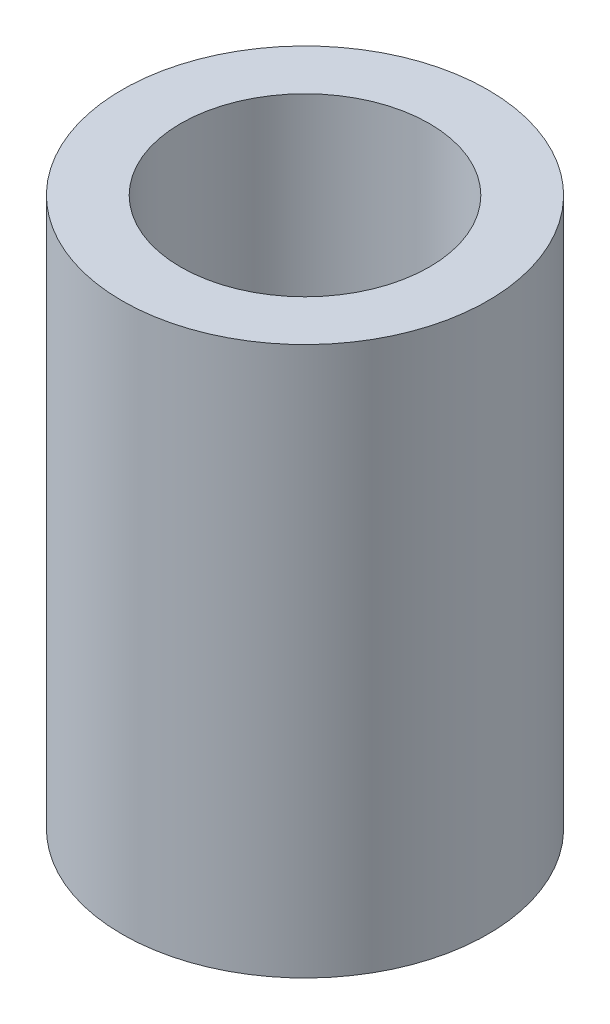
ISO-10303-21;
HEADER;
FILE_DESCRIPTION(('STEP AP214'),'2;1');
FILE_NAME('part.step','',(''),(''),'','','');
FILE_SCHEMA(('AUTOMOTIVE_DESIGN { 1 0 10303 214 1 1 1 1 }'));
ENDSEC;
DATA;
#1=APPLICATION_CONTEXT('core data for automotive mechanical design processes');
#2=APPLICATION_PROTOCOL_DEFINITION('international standard','automotive_design',2000,#1);
#3=PRODUCT_CONTEXT('',#1,'mechanical');
#4=PRODUCT('Part','Part','',(#3));
#5=PRODUCT_RELATED_PRODUCT_CATEGORY('part','',(#4));
#6=PRODUCT_DEFINITION_FORMATION('','',#4);
#7=PRODUCT_DEFINITION_CONTEXT('part definition',#1,'design');
#8=PRODUCT_DEFINITION('design','',#6,#7);
#9=PRODUCT_DEFINITION_SHAPE('','',#8);
#10=(LENGTH_UNIT() NAMED_UNIT(*) SI_UNIT(.MILLI.,.METRE.));
#11=(NAMED_UNIT(*) PLANE_ANGLE_UNIT() SI_UNIT($,.RADIAN.));
#12=(NAMED_UNIT(*) SI_UNIT($,.STERADIAN.) SOLID_ANGLE_UNIT());
#13=UNCERTAINTY_MEASURE_WITH_UNIT(LENGTH_MEASURE(1.E-05),#10,'distance_accuracy_value','');
#14=(GEOMETRIC_REPRESENTATION_CONTEXT(3) GLOBAL_UNCERTAINTY_ASSIGNED_CONTEXT((#13)) GLOBAL_UNIT_ASSIGNED_CONTEXT((#10,
#11,#12)) REPRESENTATION_CONTEXT('',''));
#15=CARTESIAN_POINT('',(0.,0.,0.));
#16=DIRECTION('',(0.,0.,1.));
#17=DIRECTION('',(1.,0.,0.));
#18=AXIS2_PLACEMENT_3D('',#15,#16,#17);
#19=CARTESIAN_POINT('',(0.,7.14375,0.));
#20=DIRECTION('',(0.,1.,0.));
#21=DIRECTION('',(0.,0.,1.));
#22=AXIS2_PLACEMENT_3D('',#19,#20,#21);
#23=PLANE('',#22);
#24=CARTESIAN_POINT('',(0.,7.14375,0.));
#25=DIRECTION('',(0.,1.,0.));
#26=DIRECTION('',(0.,0.,1.));
#27=AXIS2_PLACEMENT_3D('',#24,#25,#26);
#28=CIRCLE('',#27,4.7625);
#29=CARTESIAN_POINT('',(0.,7.14375,4.7625));
#30=VERTEX_POINT('',#29);
#31=EDGE_CURVE('E10',#30,#30,#28,.T.);
#32=ORIENTED_EDGE('',*,*,#31,.T.);
#33=EDGE_LOOP('',(#32));
#34=FACE_BOUND('',#33,.T.);
#35=CARTESIAN_POINT('',(0.,7.14375,0.));
#36=DIRECTION('',(0.,1.,0.));
#37=DIRECTION('',(0.,0.,1.));
#38=AXIS2_PLACEMENT_3D('',#35,#36,#37);
#39=CIRCLE('',#38,3.2385);
#40=CARTESIAN_POINT('',(0.,7.14375,3.2385));
#41=VERTEX_POINT('',#40);
#42=EDGE_CURVE('E46',#41,#41,#39,.T.);
#43=ORIENTED_EDGE('',*,*,#42,.F.);
#44=EDGE_LOOP('',(#43));
#45=FACE_BOUND('',#44,.T.);
#46=ADVANCED_FACE('F35',(#34,#45),#23,.T.);
#47=CARTESIAN_POINT('',(0.,-7.14375,0.));
#48=DIRECTION('',(0.,1.,0.));
#49=DIRECTION('',(0.,0.,1.));
#50=AXIS2_PLACEMENT_3D('',#47,#48,#49);
#51=PLANE('',#50);
#52=CARTESIAN_POINT('',(0.,-7.14375,0.));
#53=DIRECTION('',(0.,1.,0.));
#54=DIRECTION('',(0.,0.,1.));
#55=AXIS2_PLACEMENT_3D('',#52,#53,#54);
#56=CIRCLE('',#55,4.7625);
#57=CARTESIAN_POINT('',(0.,-7.14375,4.7625));
#58=VERTEX_POINT('',#57);
#59=EDGE_CURVE('E39',#58,#58,#56,.T.);
#60=ORIENTED_EDGE('',*,*,#59,.F.);
#61=EDGE_LOOP('',(#60));
#62=FACE_BOUND('',#61,.T.);
#63=CARTESIAN_POINT('',(0.,-7.14375,0.));
#64=DIRECTION('',(0.,1.,0.));
#65=DIRECTION('',(0.,0.,1.));
#66=AXIS2_PLACEMENT_3D('',#63,#64,#65);
#67=CIRCLE('',#66,3.2385);
#68=CARTESIAN_POINT('',(0.,-7.14375,3.2385));
#69=VERTEX_POINT('',#68);
#70=EDGE_CURVE('E48',#69,#69,#67,.T.);
#71=ORIENTED_EDGE('',*,*,#70,.T.);
#72=EDGE_LOOP('',(#71));
#73=FACE_BOUND('',#72,.T.);
#74=ADVANCED_FACE('F58',(#62,#73),#51,.F.);
#75=CARTESIAN_POINT('',(0.,7.14375,0.));
#76=DIRECTION('',(0.,-1.,0.));
#77=DIRECTION('',(0.,0.,-1.));
#78=AXIS2_PLACEMENT_3D('',#75,#76,#77);
#79=CYLINDRICAL_SURFACE('',#78,4.7625);
#80=ORIENTED_EDGE('',*,*,#31,.F.);
#81=EDGE_LOOP('',(#80));
#82=FACE_BOUND('',#81,.T.);
#83=ORIENTED_EDGE('',*,*,#59,.T.);
#84=EDGE_LOOP('',(#83));
#85=FACE_BOUND('',#84,.T.);
#86=ADVANCED_FACE('F37',(#82,#85),#79,.T.);
#87=CARTESIAN_POINT('',(0.,7.14375,0.));
#88=DIRECTION('',(0.,-1.,0.));
#89=DIRECTION('',(0.,0.,-1.));
#90=AXIS2_PLACEMENT_3D('',#87,#88,#89);
#91=CYLINDRICAL_SURFACE('',#90,3.2385);
#92=ORIENTED_EDGE('',*,*,#42,.T.);
#93=EDGE_LOOP('',(#92));
#94=FACE_BOUND('',#93,.T.);
#95=ORIENTED_EDGE('',*,*,#70,.F.);
#96=EDGE_LOOP('',(#95));
#97=FACE_BOUND('',#96,.T.);
#98=ADVANCED_FACE('F54',(#94,#97),#91,.F.);
#99=CLOSED_SHELL('',(#46,#74,#86,#98));
#100=MANIFOLD_SOLID_BREP('B2',#99);
#101=ADVANCED_BREP_SHAPE_REPRESENTATION('',(#18,#100),#14);
#102=SHAPE_DEFINITION_REPRESENTATION(#9,#101);
ENDSEC;
END-ISO-10303-21;
